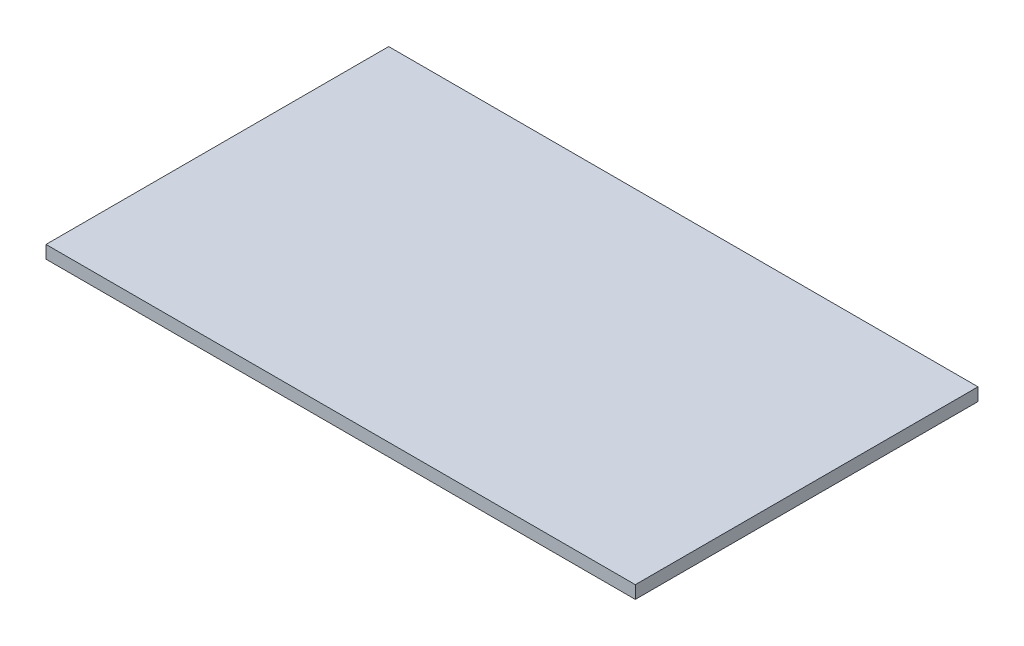
ISO-10303-21;
HEADER;
FILE_DESCRIPTION(('STEP AP214'),'2;1');
FILE_NAME('part.step','',(''),(''),'','','');
FILE_SCHEMA(('AUTOMOTIVE_DESIGN { 1 0 10303 214 1 1 1 1 }'));
ENDSEC;
DATA;
#1=APPLICATION_CONTEXT('core data for automotive mechanical design processes');
#2=APPLICATION_PROTOCOL_DEFINITION('international standard','automotive_design',2000,#1);
#3=PRODUCT_CONTEXT('',#1,'mechanical');
#4=PRODUCT('Part','Part','',(#3));
#5=PRODUCT_RELATED_PRODUCT_CATEGORY('part','',(#4));
#6=PRODUCT_DEFINITION_FORMATION('','',#4);
#7=PRODUCT_DEFINITION_CONTEXT('part definition',#1,'design');
#8=PRODUCT_DEFINITION('design','',#6,#7);
#9=PRODUCT_DEFINITION_SHAPE('','',#8);
#10=(LENGTH_UNIT() NAMED_UNIT(*) SI_UNIT(.MILLI.,.METRE.));
#11=(NAMED_UNIT(*) PLANE_ANGLE_UNIT() SI_UNIT($,.RADIAN.));
#12=(NAMED_UNIT(*) SI_UNIT($,.STERADIAN.) SOLID_ANGLE_UNIT());
#13=UNCERTAINTY_MEASURE_WITH_UNIT(LENGTH_MEASURE(1.E-05),#10,'distance_accuracy_value','');
#14=(GEOMETRIC_REPRESENTATION_CONTEXT(3) GLOBAL_UNCERTAINTY_ASSIGNED_CONTEXT((#13)) GLOBAL_UNIT_ASSIGNED_CONTEXT((#10,
#11,#12)) REPRESENTATION_CONTEXT('',''));
#15=CARTESIAN_POINT('',(0.,0.,0.));
#16=DIRECTION('',(0.,0.,1.));
#17=DIRECTION('',(1.,0.,0.));
#18=AXIS2_PLACEMENT_3D('',#15,#16,#17);
#19=CARTESIAN_POINT('',(0.,25.4,0.));
#20=DIRECTION('',(1.,0.,0.));
#21=DIRECTION('',(0.,0.,-1.));
#22=AXIS2_PLACEMENT_3D('',#19,#20,#21);
#23=PLANE('',#22);
#24=DIRECTION('',(0.,0.,1.));
#25=VECTOR('',#24,1.);
#26=CARTESIAN_POINT('',(0.,0.,0.));
#27=LINE('',#26,#25);
#28=CARTESIAN_POINT('',(-2.22044604925031E-13,0.,-679.45));
#29=VERTEX_POINT('',#28);
#30=CARTESIAN_POINT('',(0.,0.,0.));
#31=VERTEX_POINT('',#30);
#32=EDGE_CURVE('E97',#29,#31,#27,.T.);
#33=ORIENTED_EDGE('',*,*,#32,.T.);
#34=DIRECTION('',(0.,-1.,0.));
#35=VECTOR('',#34,1.);
#36=CARTESIAN_POINT('',(0.,25.4,0.));
#37=LINE('',#36,#35);
#38=CARTESIAN_POINT('',(0.,25.4,0.));
#39=VERTEX_POINT('',#38);
#40=EDGE_CURVE('E11',#39,#31,#37,.T.);
#41=ORIENTED_EDGE('',*,*,#40,.F.);
#42=DIRECTION('',(0.,0.,1.));
#43=VECTOR('',#42,1.);
#44=CARTESIAN_POINT('',(0.,25.4,0.));
#45=LINE('',#44,#43);
#46=CARTESIAN_POINT('',(-2.22044604925031E-13,25.4,-679.45));
#47=VERTEX_POINT('',#46);
#48=EDGE_CURVE('E85',#47,#39,#45,.T.);
#49=ORIENTED_EDGE('',*,*,#48,.F.);
#50=DIRECTION('',(0.,-1.,0.));
#51=VECTOR('',#50,1.);
#52=CARTESIAN_POINT('',(-2.22044604925031E-13,25.4,-679.45));
#53=LINE('',#52,#51);
#54=EDGE_CURVE('E93',#47,#29,#53,.T.);
#55=ORIENTED_EDGE('',*,*,#54,.T.);
#56=EDGE_LOOP('',(#33,#41,#49,#55));
#57=FACE_BOUND('',#56,.T.);
#58=ADVANCED_FACE('F34',(#57),#23,.F.);
#59=CARTESIAN_POINT('',(0.,25.4,0.));
#60=DIRECTION('',(0.,0.,-1.));
#61=DIRECTION('',(-1.,0.,0.));
#62=AXIS2_PLACEMENT_3D('',#59,#60,#61);
#63=PLANE('',#62);
#64=DIRECTION('',(1.,0.,0.));
#65=VECTOR('',#64,1.);
#66=CARTESIAN_POINT('',(0.,0.,0.));
#67=LINE('',#66,#65);
#68=CARTESIAN_POINT('',(1168.4,0.,0.));
#69=VERTEX_POINT('',#68);
#70=EDGE_CURVE('E89',#31,#69,#67,.T.);
#71=ORIENTED_EDGE('',*,*,#70,.T.);
#72=DIRECTION('',(0.,-1.,0.));
#73=VECTOR('',#72,1.);
#74=CARTESIAN_POINT('',(1168.4,25.4,0.));
#75=LINE('',#74,#73);
#76=CARTESIAN_POINT('',(1168.4,25.4,0.));
#77=VERTEX_POINT('',#76);
#78=EDGE_CURVE('E42',#77,#69,#75,.T.);
#79=ORIENTED_EDGE('',*,*,#78,.F.);
#80=DIRECTION('',(1.,0.,0.));
#81=VECTOR('',#80,1.);
#82=CARTESIAN_POINT('',(0.,25.4,0.));
#83=LINE('',#82,#81);
#84=EDGE_CURVE('E80',#39,#77,#83,.T.);
#85=ORIENTED_EDGE('',*,*,#84,.F.);
#86=ORIENTED_EDGE('',*,*,#40,.T.);
#87=EDGE_LOOP('',(#71,#79,#85,#86));
#88=FACE_BOUND('',#87,.T.);
#89=ADVANCED_FACE('F88',(#88),#63,.F.);
#90=CARTESIAN_POINT('',(1168.4,25.4,0.));
#91=DIRECTION('',(-1.,0.,0.));
#92=DIRECTION('',(0.,0.,1.));
#93=AXIS2_PLACEMENT_3D('',#90,#91,#92);
#94=PLANE('',#93);
#95=DIRECTION('',(0.,0.,-1.));
#96=VECTOR('',#95,1.);
#97=CARTESIAN_POINT('',(1168.4,0.,0.));
#98=LINE('',#97,#96);
#99=CARTESIAN_POINT('',(1168.4,0.,-679.45));
#100=VERTEX_POINT('',#99);
#101=EDGE_CURVE('E67',#69,#100,#98,.T.);
#102=ORIENTED_EDGE('',*,*,#101,.T.);
#103=DIRECTION('',(0.,-1.,0.));
#104=VECTOR('',#103,1.);
#105=CARTESIAN_POINT('',(1168.4,25.4,-679.45));
#106=LINE('',#105,#104);
#107=CARTESIAN_POINT('',(1168.4,25.4,-679.45));
#108=VERTEX_POINT('',#107);
#109=EDGE_CURVE('E90',#108,#100,#106,.T.);
#110=ORIENTED_EDGE('',*,*,#109,.F.);
#111=DIRECTION('',(0.,0.,-1.));
#112=VECTOR('',#111,1.);
#113=CARTESIAN_POINT('',(1168.4,25.4,0.));
#114=LINE('',#113,#112);
#115=EDGE_CURVE('E83',#77,#108,#114,.T.);
#116=ORIENTED_EDGE('',*,*,#115,.F.);
#117=ORIENTED_EDGE('',*,*,#78,.T.);
#118=EDGE_LOOP('',(#102,#110,#116,#117));
#119=FACE_BOUND('',#118,.T.);
#120=ADVANCED_FACE('F91',(#119),#94,.F.);
#121=CARTESIAN_POINT('',(-2.22044604925031E-13,25.4,-679.45));
#122=DIRECTION('',(0.,0.,1.));
#123=DIRECTION('',(1.,0.,0.));
#124=AXIS2_PLACEMENT_3D('',#121,#122,#123);
#125=PLANE('',#124);
#126=DIRECTION('',(-1.,0.,0.));
#127=VECTOR('',#126,1.);
#128=CARTESIAN_POINT('',(-2.22044604925031E-13,0.,-679.45));
#129=LINE('',#128,#127);
#130=EDGE_CURVE('E73',#100,#29,#129,.T.);
#131=ORIENTED_EDGE('',*,*,#130,.T.);
#132=ORIENTED_EDGE('',*,*,#54,.F.);
#133=DIRECTION('',(-1.,0.,0.));
#134=VECTOR('',#133,1.);
#135=CARTESIAN_POINT('',(-2.22044604925031E-13,25.4,-679.45));
#136=LINE('',#135,#134);
#137=EDGE_CURVE('E50',#108,#47,#136,.T.);
#138=ORIENTED_EDGE('',*,*,#137,.F.);
#139=ORIENTED_EDGE('',*,*,#109,.T.);
#140=EDGE_LOOP('',(#131,#132,#138,#139));
#141=FACE_BOUND('',#140,.T.);
#142=ADVANCED_FACE('F104',(#141),#125,.F.);
#143=CARTESIAN_POINT('',(0.,25.4,0.));
#144=DIRECTION('',(0.,-1.,0.));
#145=DIRECTION('',(0.,0.,-1.));
#146=AXIS2_PLACEMENT_3D('',#143,#144,#145);
#147=PLANE('',#146);
#148=ORIENTED_EDGE('',*,*,#48,.T.);
#149=ORIENTED_EDGE('',*,*,#84,.T.);
#150=ORIENTED_EDGE('',*,*,#115,.T.);
#151=ORIENTED_EDGE('',*,*,#137,.T.);
#152=EDGE_LOOP('',(#148,#149,#150,#151));
#153=FACE_BOUND('',#152,.T.);
#154=ADVANCED_FACE('F81',(#153),#147,.F.);
#155=CARTESIAN_POINT('',(0.,0.,0.));
#156=DIRECTION('',(0.,-1.,0.));
#157=DIRECTION('',(0.,0.,-1.));
#158=AXIS2_PLACEMENT_3D('',#155,#156,#157);
#159=PLANE('',#158);
#160=ORIENTED_EDGE('',*,*,#32,.F.);
#161=ORIENTED_EDGE('',*,*,#130,.F.);
#162=ORIENTED_EDGE('',*,*,#101,.F.);
#163=ORIENTED_EDGE('',*,*,#70,.F.);
#164=EDGE_LOOP('',(#160,#161,#162,#163));
#165=FACE_BOUND('',#164,.T.);
#166=ADVANCED_FACE('F107',(#165),#159,.T.);
#167=CLOSED_SHELL('',(#58,#89,#120,#142,#154,#166));
#168=MANIFOLD_SOLID_BREP('B2',#167);
#169=ADVANCED_BREP_SHAPE_REPRESENTATION('',(#18,#168),#14);
#170=SHAPE_DEFINITION_REPRESENTATION(#9,#169);
ENDSEC;
END-ISO-10303-21;
